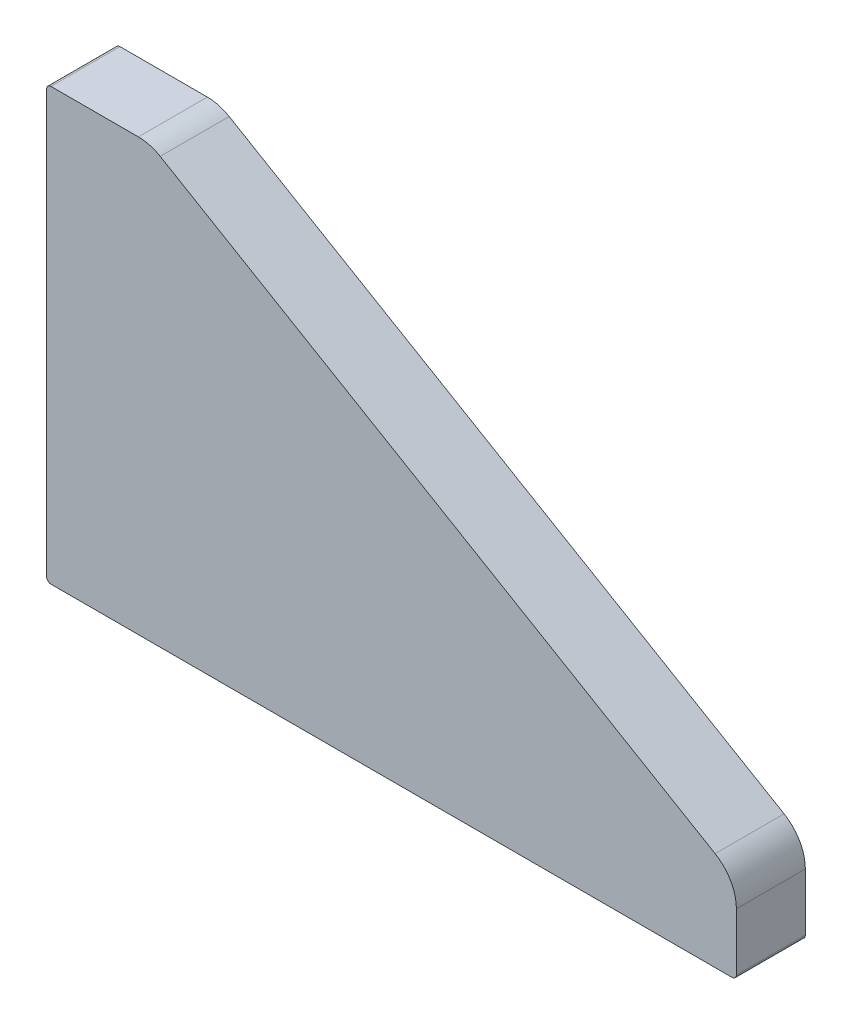
ISO-10303-21;
HEADER;
FILE_DESCRIPTION(('STEP AP214'),'2;1');
FILE_NAME('part.step','',(''),(''),'','','');
FILE_SCHEMA(('AUTOMOTIVE_DESIGN { 1 0 10303 214 1 1 1 1 }'));
ENDSEC;
DATA;
#1=APPLICATION_CONTEXT('core data for automotive mechanical design processes');
#2=APPLICATION_PROTOCOL_DEFINITION('international standard','automotive_design',2000,#1);
#3=PRODUCT_CONTEXT('',#1,'mechanical');
#4=PRODUCT('Part','Part','',(#3));
#5=PRODUCT_RELATED_PRODUCT_CATEGORY('part','',(#4));
#6=PRODUCT_DEFINITION_FORMATION('','',#4);
#7=PRODUCT_DEFINITION_CONTEXT('part definition',#1,'design');
#8=PRODUCT_DEFINITION('design','',#6,#7);
#9=PRODUCT_DEFINITION_SHAPE('','',#8);
#10=(LENGTH_UNIT() NAMED_UNIT(*) SI_UNIT(.MILLI.,.METRE.));
#11=(NAMED_UNIT(*) PLANE_ANGLE_UNIT() SI_UNIT($,.RADIAN.));
#12=(NAMED_UNIT(*) SI_UNIT($,.STERADIAN.) SOLID_ANGLE_UNIT());
#13=UNCERTAINTY_MEASURE_WITH_UNIT(LENGTH_MEASURE(1.E-05),#10,'distance_accuracy_value','');
#14=(GEOMETRIC_REPRESENTATION_CONTEXT(3) GLOBAL_UNCERTAINTY_ASSIGNED_CONTEXT((#13)) GLOBAL_UNIT_ASSIGNED_CONTEXT((#10,
#11,#12)) REPRESENTATION_CONTEXT('',''));
#15=CARTESIAN_POINT('',(0.,0.,0.));
#16=DIRECTION('',(0.,0.,1.));
#17=DIRECTION('',(1.,0.,0.));
#18=AXIS2_PLACEMENT_3D('',#15,#16,#17);
#19=CARTESIAN_POINT('',(0.,50.,8.));
#20=DIRECTION('',(1.,0.,0.));
#21=DIRECTION('',(0.,1.,0.));
#22=AXIS2_PLACEMENT_3D('',#19,#20,#21);
#23=PLANE('',#22);
#24=CARTESIAN_POINT('',(0.,6.,4.));
#25=DIRECTION('',(-1.,0.,0.));
#26=DIRECTION('',(0.,0.,1.));
#27=AXIS2_PLACEMENT_3D('',#24,#25,#26);
#28=CIRCLE('',#27,1.64999999999999);
#29=CARTESIAN_POINT('',(0.,6.,5.64999999999999));
#30=VERTEX_POINT('',#29);
#31=EDGE_CURVE('E172',#30,#30,#28,.T.);
#32=ORIENTED_EDGE('',*,*,#31,.F.);
#33=EDGE_LOOP('',(#32));
#34=FACE_BOUND('',#33,.T.);
#35=DIRECTION('',(0.,-1.,0.));
#36=VECTOR('',#35,1.);
#37=CARTESIAN_POINT('',(0.,50.,0.));
#38=LINE('',#37,#36);
#39=CARTESIAN_POINT('',(0.,49.5,0.));
#40=VERTEX_POINT('',#39);
#41=CARTESIAN_POINT('',(0.,0.5,0.));
#42=VERTEX_POINT('',#41);
#43=EDGE_CURVE('E180',#40,#42,#38,.T.);
#44=ORIENTED_EDGE('',*,*,#43,.T.);
#45=DIRECTION('',(0.,0.,-1.));
#46=VECTOR('',#45,1.);
#47=CARTESIAN_POINT('',(0.,0.5,8.));
#48=LINE('',#47,#46);
#49=CARTESIAN_POINT('',(0.,0.5,8.));
#50=VERTEX_POINT('',#49);
#51=EDGE_CURVE('E263',#42,#50,#48,.F.);
#52=ORIENTED_EDGE('',*,*,#51,.T.);
#53=DIRECTION('',(0.,-1.,0.));
#54=VECTOR('',#53,1.);
#55=CARTESIAN_POINT('',(0.,50.,8.));
#56=LINE('',#55,#54);
#57=CARTESIAN_POINT('',(0.,49.5,8.));
#58=VERTEX_POINT('',#57);
#59=EDGE_CURVE('E181',#58,#50,#56,.T.);
#60=ORIENTED_EDGE('',*,*,#59,.F.);
#61=DIRECTION('',(0.,0.,-1.));
#62=VECTOR('',#61,1.);
#63=CARTESIAN_POINT('',(0.,49.5,8.));
#64=LINE('',#63,#62);
#65=EDGE_CURVE('E259',#58,#40,#64,.T.);
#66=ORIENTED_EDGE('',*,*,#65,.T.);
#67=EDGE_LOOP('',(#44,#52,#60,#66));
#68=FACE_BOUND('',#67,.T.);
#69=CARTESIAN_POINT('',(0.,43.5,4.));
#70=DIRECTION('',(-1.,0.,0.));
#71=DIRECTION('',(0.,0.,1.));
#72=AXIS2_PLACEMENT_3D('',#69,#70,#71);
#73=CIRCLE('',#72,1.64999999999999);
#74=CARTESIAN_POINT('',(0.,43.5,5.64999999999999));
#75=VERTEX_POINT('',#74);
#76=EDGE_CURVE('E164',#75,#75,#73,.T.);
#77=ORIENTED_EDGE('',*,*,#76,.F.);
#78=EDGE_LOOP('',(#77));
#79=FACE_BOUND('',#78,.T.);
#80=ADVANCED_FACE('F47',(#34,#68,#79),#23,.F.);
#81=CARTESIAN_POINT('',(0.,0.,8.));
#82=DIRECTION('',(0.,1.,0.));
#83=DIRECTION('',(0.,0.,1.));
#84=AXIS2_PLACEMENT_3D('',#81,#82,#83);
#85=PLANE('',#84);
#86=CARTESIAN_POINT('',(20.,0.,4.));
#87=DIRECTION('',(0.,-1.,0.));
#88=DIRECTION('',(0.,0.,-1.));
#89=AXIS2_PLACEMENT_3D('',#86,#87,#88);
#90=CIRCLE('',#89,1.64999999999999);
#91=CARTESIAN_POINT('',(20.,0.,2.35000000000001));
#92=VERTEX_POINT('',#91);
#93=EDGE_CURVE('E149',#92,#92,#90,.T.);
#94=ORIENTED_EDGE('',*,*,#93,.F.);
#95=EDGE_LOOP('',(#94));
#96=FACE_BOUND('',#95,.T.);
#97=CARTESIAN_POINT('',(65.,0.,4.));
#98=DIRECTION('',(0.,-1.,0.));
#99=DIRECTION('',(0.,0.,-1.));
#100=AXIS2_PLACEMENT_3D('',#97,#98,#99);
#101=CIRCLE('',#100,1.64999999999998);
#102=CARTESIAN_POINT('',(65.,0.,2.35000000000002));
#103=VERTEX_POINT('',#102);
#104=EDGE_CURVE('E148',#103,#103,#101,.T.);
#105=ORIENTED_EDGE('',*,*,#104,.F.);
#106=EDGE_LOOP('',(#105));
#107=FACE_BOUND('',#106,.T.);
#108=DIRECTION('',(1.,0.,0.));
#109=VECTOR('',#108,1.);
#110=CARTESIAN_POINT('',(0.,0.,8.));
#111=LINE('',#110,#109);
#112=CARTESIAN_POINT('',(0.5,0.,8.));
#113=VERTEX_POINT('',#112);
#114=CARTESIAN_POINT('',(79.5,0.,8.));
#115=VERTEX_POINT('',#114);
#116=EDGE_CURVE('E185',#113,#115,#111,.T.);
#117=ORIENTED_EDGE('',*,*,#116,.F.);
#118=DIRECTION('',(0.,0.,-1.));
#119=VECTOR('',#118,1.);
#120=CARTESIAN_POINT('',(0.5,0.,8.));
#121=LINE('',#120,#119);
#122=CARTESIAN_POINT('',(0.5,0.,0.));
#123=VERTEX_POINT('',#122);
#124=EDGE_CURVE('E246',#113,#123,#121,.T.);
#125=ORIENTED_EDGE('',*,*,#124,.T.);
#126=DIRECTION('',(1.,0.,0.));
#127=VECTOR('',#126,1.);
#128=CARTESIAN_POINT('',(0.,0.,0.));
#129=LINE('',#128,#127);
#130=CARTESIAN_POINT('',(79.5,0.,0.));
#131=VERTEX_POINT('',#130);
#132=EDGE_CURVE('E203',#123,#131,#129,.T.);
#133=ORIENTED_EDGE('',*,*,#132,.T.);
#134=DIRECTION('',(0.,0.,-1.));
#135=VECTOR('',#134,1.);
#136=CARTESIAN_POINT('',(79.5,0.,8.));
#137=LINE('',#136,#135);
#138=EDGE_CURVE('E243',#131,#115,#137,.F.);
#139=ORIENTED_EDGE('',*,*,#138,.T.);
#140=EDGE_LOOP('',(#117,#125,#133,#139));
#141=FACE_BOUND('',#140,.T.);
#142=ADVANCED_FACE('F356',(#96,#107,#141),#85,.F.);
#143=CARTESIAN_POINT('',(80.,0.,8.));
#144=DIRECTION('',(-1.,0.,0.));
#145=DIRECTION('',(0.,0.,1.));
#146=AXIS2_PLACEMENT_3D('',#143,#144,#145);
#147=PLANE('',#146);
#148=DIRECTION('',(0.,1.,0.));
#149=VECTOR('',#148,1.);
#150=CARTESIAN_POINT('',(80.,0.,8.));
#151=LINE('',#150,#149);
#152=CARTESIAN_POINT('',(80.,0.5,8.));
#153=VERTEX_POINT('',#152);
#154=CARTESIAN_POINT('',(80.,7.14026972843647,8.));
#155=VERTEX_POINT('',#154);
#156=EDGE_CURVE('E189',#153,#155,#151,.T.);
#157=ORIENTED_EDGE('',*,*,#156,.F.);
#158=DIRECTION('',(0.,0.,-1.));
#159=VECTOR('',#158,1.);
#160=CARTESIAN_POINT('',(80.,0.5,8.));
#161=LINE('',#160,#159);
#162=CARTESIAN_POINT('',(80.,0.5,0.));
#163=VERTEX_POINT('',#162);
#164=EDGE_CURVE('E11',#153,#163,#161,.T.);
#165=ORIENTED_EDGE('',*,*,#164,.T.);
#166=DIRECTION('',(0.,1.,0.));
#167=VECTOR('',#166,1.);
#168=CARTESIAN_POINT('',(80.,0.,0.));
#169=LINE('',#168,#167);
#170=CARTESIAN_POINT('',(80.,7.14026972843647,0.));
#171=VERTEX_POINT('',#170);
#172=EDGE_CURVE('E207',#163,#171,#169,.T.);
#173=ORIENTED_EDGE('',*,*,#172,.T.);
#174=DIRECTION('',(0.,0.,-1.));
#175=VECTOR('',#174,1.);
#176=CARTESIAN_POINT('',(80.,7.14026972843647,8.));
#177=LINE('',#176,#175);
#178=EDGE_CURVE('E229',#171,#155,#177,.F.);
#179=ORIENTED_EDGE('',*,*,#178,.T.);
#180=EDGE_LOOP('',(#157,#165,#173,#179));
#181=FACE_BOUND('',#180,.T.);
#182=ADVANCED_FACE('F387',(#181),#147,.F.);
#183=CARTESIAN_POINT('',(80.,10.,8.));
#184=DIRECTION('',(-0.507020126563394,-0.861934215157769,0.));
#185=DIRECTION('',(0.86193421515777,-0.507020126563394,0.));
#186=AXIS2_PLACEMENT_3D('',#183,#184,#185);
#187=PLANE('',#186);
#188=DIRECTION('',(-0.86193421515777,0.507020126563394,0.));
#189=VECTOR('',#188,1.);
#190=CARTESIAN_POINT('',(80.,10.,8.));
#191=LINE('',#190,#189);
#192=CARTESIAN_POINT('',(77.535100632817,11.4499408042253,8.));
#193=VERTEX_POINT('',#192);
#194=CARTESIAN_POINT('',(13.1735591711589,49.3096710757889,8.));
#195=VERTEX_POINT('',#194);
#196=EDGE_CURVE('E192',#193,#195,#191,.T.);
#197=ORIENTED_EDGE('',*,*,#196,.F.);
#198=DIRECTION('',(0.,0.,-1.));
#199=VECTOR('',#198,1.);
#200=CARTESIAN_POINT('',(77.535100632817,11.4499408042253,8.));
#201=LINE('',#200,#199);
#202=CARTESIAN_POINT('',(77.535100632817,11.4499408042253,0.));
#203=VERTEX_POINT('',#202);
#204=EDGE_CURVE('E218',#193,#203,#201,.T.);
#205=ORIENTED_EDGE('',*,*,#204,.T.);
#206=DIRECTION('',(-0.86193421515777,0.507020126563394,0.));
#207=VECTOR('',#206,1.);
#208=CARTESIAN_POINT('',(80.,10.,0.));
#209=LINE('',#208,#207);
#210=CARTESIAN_POINT('',(13.1735591711589,49.3096710757889,0.));
#211=VERTEX_POINT('',#210);
#212=EDGE_CURVE('E210',#203,#211,#209,.T.);
#213=ORIENTED_EDGE('',*,*,#212,.T.);
#214=DIRECTION('',(0.,0.,-1.));
#215=VECTOR('',#214,1.);
#216=CARTESIAN_POINT('',(13.173559171159,49.3096710757889,8.));
#217=LINE('',#216,#215);
#218=EDGE_CURVE('E199',#211,#195,#217,.F.);
#219=ORIENTED_EDGE('',*,*,#218,.T.);
#220=EDGE_LOOP('',(#197,#205,#213,#219));
#221=FACE_BOUND('',#220,.T.);
#222=ADVANCED_FACE('F379',(#221),#187,.F.);
#223=CARTESIAN_POINT('',(12.,50.,8.));
#224=DIRECTION('',(0.,-1.,0.));
#225=DIRECTION('',(0.,0.,-1.));
#226=AXIS2_PLACEMENT_3D('',#223,#224,#225);
#227=PLANE('',#226);
#228=DIRECTION('',(-1.,0.,0.));
#229=VECTOR('',#228,1.);
#230=CARTESIAN_POINT('',(12.,50.,0.));
#231=LINE('',#230,#229);
#232=CARTESIAN_POINT('',(10.638458538342,50.,0.));
#233=VERTEX_POINT('',#232);
#234=CARTESIAN_POINT('',(0.499999999999999,50.,0.));
#235=VERTEX_POINT('',#234);
#236=EDGE_CURVE('E186',#233,#235,#231,.T.);
#237=ORIENTED_EDGE('',*,*,#236,.T.);
#238=DIRECTION('',(0.,0.,-1.));
#239=VECTOR('',#238,1.);
#240=CARTESIAN_POINT('',(0.499999999999999,50.,8.));
#241=LINE('',#240,#239);
#242=CARTESIAN_POINT('',(0.499999999999999,50.,8.));
#243=VERTEX_POINT('',#242);
#244=EDGE_CURVE('E56',#235,#243,#241,.F.);
#245=ORIENTED_EDGE('',*,*,#244,.T.);
#246=DIRECTION('',(-1.,0.,0.));
#247=VECTOR('',#246,1.);
#248=CARTESIAN_POINT('',(12.,50.,8.));
#249=LINE('',#248,#247);
#250=CARTESIAN_POINT('',(10.638458538342,50.,8.));
#251=VERTEX_POINT('',#250);
#252=EDGE_CURVE('E196',#251,#243,#249,.T.);
#253=ORIENTED_EDGE('',*,*,#252,.F.);
#254=DIRECTION('',(0.,0.,-1.));
#255=VECTOR('',#254,1.);
#256=CARTESIAN_POINT('',(10.638458538342,50.,8.));
#257=LINE('',#256,#255);
#258=EDGE_CURVE('E239',#251,#233,#257,.T.);
#259=ORIENTED_EDGE('',*,*,#258,.T.);
#260=EDGE_LOOP('',(#237,#245,#253,#259));
#261=FACE_BOUND('',#260,.T.);
#262=ADVANCED_FACE('F370',(#261),#227,.F.);
#263=CARTESIAN_POINT('',(0.,0.,8.));
#264=DIRECTION('',(0.,0.,1.));
#265=DIRECTION('',(1.,0.,0.));
#266=AXIS2_PLACEMENT_3D('',#263,#264,#265);
#267=PLANE('',#266);
#268=ORIENTED_EDGE('',*,*,#59,.T.);
#269=CARTESIAN_POINT('',(0.5,0.5,8.));
#270=DIRECTION('',(0.,0.,1.));
#271=DIRECTION('',(1.,0.,0.));
#272=AXIS2_PLACEMENT_3D('',#269,#270,#271);
#273=CIRCLE('',#272,0.5);
#274=EDGE_CURVE('E271',#50,#113,#273,.T.);
#275=ORIENTED_EDGE('',*,*,#274,.T.);
#276=ORIENTED_EDGE('',*,*,#116,.T.);
#277=CARTESIAN_POINT('',(79.5,0.5,8.));
#278=DIRECTION('',(0.,0.,1.));
#279=DIRECTION('',(1.,0.,0.));
#280=AXIS2_PLACEMENT_3D('',#277,#278,#279);
#281=CIRCLE('',#280,0.5);
#282=EDGE_CURVE('E70',#115,#153,#281,.T.);
#283=ORIENTED_EDGE('',*,*,#282,.T.);
#284=ORIENTED_EDGE('',*,*,#156,.T.);
#285=CARTESIAN_POINT('',(75.,7.14026972843647,8.));
#286=DIRECTION('',(0.,0.,1.));
#287=DIRECTION('',(1.,0.,0.));
#288=AXIS2_PLACEMENT_3D('',#285,#286,#287);
#289=CIRCLE('',#288,5.);
#290=EDGE_CURVE('E236',#155,#193,#289,.T.);
#291=ORIENTED_EDGE('',*,*,#290,.T.);
#292=ORIENTED_EDGE('',*,*,#196,.T.);
#293=CARTESIAN_POINT('',(10.638458538342,45.,8.));
#294=DIRECTION('',(0.,0.,1.));
#295=DIRECTION('',(1.,0.,0.));
#296=AXIS2_PLACEMENT_3D('',#293,#294,#295);
#297=CIRCLE('',#296,5.);
#298=EDGE_CURVE('E233',#195,#251,#297,.T.);
#299=ORIENTED_EDGE('',*,*,#298,.T.);
#300=ORIENTED_EDGE('',*,*,#252,.T.);
#301=CARTESIAN_POINT('',(0.499999999999999,49.5,8.));
#302=DIRECTION('',(0.,0.,1.));
#303=DIRECTION('',(1.,0.,0.));
#304=AXIS2_PLACEMENT_3D('',#301,#302,#303);
#305=CIRCLE('',#304,0.5);
#306=EDGE_CURVE('E268',#243,#58,#305,.T.);
#307=ORIENTED_EDGE('',*,*,#306,.T.);
#308=EDGE_LOOP('',(#268,#275,#276,#283,#284,#291,#292,#299,#300,#307));
#309=FACE_BOUND('',#308,.T.);
#310=ADVANCED_FACE('F350',(#309),#267,.T.);
#311=CARTESIAN_POINT('',(0.,0.,0.));
#312=DIRECTION('',(0.,0.,1.));
#313=DIRECTION('',(1.,0.,0.));
#314=AXIS2_PLACEMENT_3D('',#311,#312,#313);
#315=PLANE('',#314);
#316=ORIENTED_EDGE('',*,*,#132,.F.);
#317=CARTESIAN_POINT('',(0.5,0.5,0.));
#318=DIRECTION('',(0.,0.,1.));
#319=DIRECTION('',(1.,0.,0.));
#320=AXIS2_PLACEMENT_3D('',#317,#318,#319);
#321=CIRCLE('',#320,0.5);
#322=EDGE_CURVE('E256',#123,#42,#321,.F.);
#323=ORIENTED_EDGE('',*,*,#322,.T.);
#324=ORIENTED_EDGE('',*,*,#43,.F.);
#325=CARTESIAN_POINT('',(0.499999999999999,49.5,0.));
#326=DIRECTION('',(0.,0.,1.));
#327=DIRECTION('',(1.,0.,0.));
#328=AXIS2_PLACEMENT_3D('',#325,#326,#327);
#329=CIRCLE('',#328,0.5);
#330=EDGE_CURVE('E253',#40,#235,#329,.F.);
#331=ORIENTED_EDGE('',*,*,#330,.T.);
#332=ORIENTED_EDGE('',*,*,#236,.F.);
#333=CARTESIAN_POINT('',(10.638458538342,45.,0.));
#334=DIRECTION('',(0.,0.,1.));
#335=DIRECTION('',(1.,0.,0.));
#336=AXIS2_PLACEMENT_3D('',#333,#334,#335);
#337=CIRCLE('',#336,5.);
#338=EDGE_CURVE('E222',#233,#211,#337,.F.);
#339=ORIENTED_EDGE('',*,*,#338,.T.);
#340=ORIENTED_EDGE('',*,*,#212,.F.);
#341=CARTESIAN_POINT('',(75.,7.14026972843647,0.));
#342=DIRECTION('',(0.,0.,1.));
#343=DIRECTION('',(1.,0.,0.));
#344=AXIS2_PLACEMENT_3D('',#341,#342,#343);
#345=CIRCLE('',#344,5.);
#346=EDGE_CURVE('E225',#203,#171,#345,.F.);
#347=ORIENTED_EDGE('',*,*,#346,.T.);
#348=ORIENTED_EDGE('',*,*,#172,.F.);
#349=CARTESIAN_POINT('',(79.5,0.5,0.));
#350=DIRECTION('',(0.,0.,1.));
#351=DIRECTION('',(1.,0.,0.));
#352=AXIS2_PLACEMENT_3D('',#349,#350,#351);
#353=CIRCLE('',#352,0.5);
#354=EDGE_CURVE('E250',#163,#131,#353,.F.);
#355=ORIENTED_EDGE('',*,*,#354,.T.);
#356=EDGE_LOOP('',(#316,#323,#324,#331,#332,#339,#340,#347,#348,#355));
#357=FACE_BOUND('',#356,.T.);
#358=ADVANCED_FACE('F362',(#357),#315,.F.);
#359=CARTESIAN_POINT('',(75.,7.14026972843647,8.));
#360=DIRECTION('',(0.,0.,-1.));
#361=DIRECTION('',(-1.,0.,0.));
#362=AXIS2_PLACEMENT_3D('',#359,#360,#361);
#363=CYLINDRICAL_SURFACE('',#362,5.);
#364=ORIENTED_EDGE('',*,*,#290,.F.);
#365=ORIENTED_EDGE('',*,*,#178,.F.);
#366=ORIENTED_EDGE('',*,*,#346,.F.);
#367=ORIENTED_EDGE('',*,*,#204,.F.);
#368=EDGE_LOOP('',(#364,#365,#366,#367));
#369=FACE_BOUND('',#368,.T.);
#370=ADVANCED_FACE('F383',(#369),#363,.T.);
#371=CARTESIAN_POINT('',(10.638458538342,45.,8.));
#372=DIRECTION('',(0.,0.,-1.));
#373=DIRECTION('',(-1.,0.,0.));
#374=AXIS2_PLACEMENT_3D('',#371,#372,#373);
#375=CYLINDRICAL_SURFACE('',#374,5.);
#376=ORIENTED_EDGE('',*,*,#298,.F.);
#377=ORIENTED_EDGE('',*,*,#218,.F.);
#378=ORIENTED_EDGE('',*,*,#338,.F.);
#379=ORIENTED_EDGE('',*,*,#258,.F.);
#380=EDGE_LOOP('',(#376,#377,#378,#379));
#381=FACE_BOUND('',#380,.T.);
#382=ADVANCED_FACE('F374',(#381),#375,.T.);
#383=CARTESIAN_POINT('',(0.5,0.5,8.));
#384=DIRECTION('',(0.,0.,-1.));
#385=DIRECTION('',(-1.,0.,0.));
#386=AXIS2_PLACEMENT_3D('',#383,#384,#385);
#387=CYLINDRICAL_SURFACE('',#386,0.5);
#388=ORIENTED_EDGE('',*,*,#274,.F.);
#389=ORIENTED_EDGE('',*,*,#51,.F.);
#390=ORIENTED_EDGE('',*,*,#322,.F.);
#391=ORIENTED_EDGE('',*,*,#124,.F.);
#392=EDGE_LOOP('',(#388,#389,#390,#391));
#393=FACE_BOUND('',#392,.T.);
#394=ADVANCED_FACE('F359',(#393),#387,.T.);
#395=CARTESIAN_POINT('',(0.499999999999999,49.5,8.));
#396=DIRECTION('',(0.,0.,-1.));
#397=DIRECTION('',(-1.,0.,0.));
#398=AXIS2_PLACEMENT_3D('',#395,#396,#397);
#399=CYLINDRICAL_SURFACE('',#398,0.5);
#400=ORIENTED_EDGE('',*,*,#306,.F.);
#401=ORIENTED_EDGE('',*,*,#244,.F.);
#402=ORIENTED_EDGE('',*,*,#330,.F.);
#403=ORIENTED_EDGE('',*,*,#65,.F.);
#404=EDGE_LOOP('',(#400,#401,#402,#403));
#405=FACE_BOUND('',#404,.T.);
#406=ADVANCED_FACE('F368',(#405),#399,.T.);
#407=CARTESIAN_POINT('',(79.5,0.5,8.));
#408=DIRECTION('',(0.,0.,-1.));
#409=DIRECTION('',(-1.,0.,0.));
#410=AXIS2_PLACEMENT_3D('',#407,#408,#409);
#411=CYLINDRICAL_SURFACE('',#410,0.5);
#412=ORIENTED_EDGE('',*,*,#282,.F.);
#413=ORIENTED_EDGE('',*,*,#138,.F.);
#414=ORIENTED_EDGE('',*,*,#354,.F.);
#415=ORIENTED_EDGE('',*,*,#164,.F.);
#416=EDGE_LOOP('',(#412,#413,#414,#415));
#417=FACE_BOUND('',#416,.T.);
#418=ADVANCED_FACE('F49',(#417),#411,.T.);
#419=CARTESIAN_POINT('',(14.6,6.,4.));
#420=DIRECTION('',(-1.,0.,0.));
#421=DIRECTION('',(0.,0.,1.));
#422=AXIS2_PLACEMENT_3D('',#419,#420,#421);
#423=CONICAL_SURFACE('',#422,1.65,1.02974425867665);
#424=CARTESIAN_POINT('',(15.5914200213955,6.,4.));
#425=VERTEX_POINT('',#424);
#426=VERTEX_LOOP('',#425);
#427=FACE_BOUND('',#426,.T.);
#428=CARTESIAN_POINT('',(14.6,6.,4.));
#429=DIRECTION('',(-1.,0.,0.));
#430=DIRECTION('',(0.,0.,1.));
#431=AXIS2_PLACEMENT_3D('',#428,#429,#430);
#432=CIRCLE('',#431,1.65);
#433=CARTESIAN_POINT('',(14.6,6.,5.65));
#434=VERTEX_POINT('',#433);
#435=EDGE_CURVE('E176',#434,#434,#432,.T.);
#436=ORIENTED_EDGE('',*,*,#435,.T.);
#437=EDGE_LOOP('',(#436));
#438=FACE_BOUND('',#437,.T.);
#439=ADVANCED_FACE('F391',(#427,#438),#423,.F.);
#440=CARTESIAN_POINT('',(0.,6.,4.));
#441=DIRECTION('',(-1.,0.,0.));
#442=DIRECTION('',(0.,0.,1.));
#443=AXIS2_PLACEMENT_3D('',#440,#441,#442);
#444=CYLINDRICAL_SURFACE('',#443,1.64999999999999);
#445=ORIENTED_EDGE('',*,*,#435,.F.);
#446=EDGE_LOOP('',(#445));
#447=FACE_BOUND('',#446,.T.);
#448=ORIENTED_EDGE('',*,*,#31,.T.);
#449=EDGE_LOOP('',(#448));
#450=FACE_BOUND('',#449,.T.);
#451=ADVANCED_FACE('F396',(#447,#450),#444,.F.);
#452=CARTESIAN_POINT('',(14.6,43.5,4.));
#453=DIRECTION('',(-1.,0.,0.));
#454=DIRECTION('',(0.,0.,1.));
#455=AXIS2_PLACEMENT_3D('',#452,#453,#454);
#456=CONICAL_SURFACE('',#455,1.65,1.02974425867665);
#457=CARTESIAN_POINT('',(15.5914200213955,43.5,4.));
#458=VERTEX_POINT('',#457);
#459=VERTEX_LOOP('',#458);
#460=FACE_BOUND('',#459,.T.);
#461=CARTESIAN_POINT('',(14.6,43.5,4.));
#462=DIRECTION('',(-1.,0.,0.));
#463=DIRECTION('',(0.,0.,1.));
#464=AXIS2_PLACEMENT_3D('',#461,#462,#463);
#465=CIRCLE('',#464,1.65);
#466=CARTESIAN_POINT('',(14.6,43.5,5.65));
#467=VERTEX_POINT('',#466);
#468=EDGE_CURVE('E168',#467,#467,#465,.T.);
#469=ORIENTED_EDGE('',*,*,#468,.T.);
#470=EDGE_LOOP('',(#469));
#471=FACE_BOUND('',#470,.T.);
#472=ADVANCED_FACE('F444',(#460,#471),#456,.F.);
#473=CARTESIAN_POINT('',(0.,43.5,4.));
#474=DIRECTION('',(-1.,0.,0.));
#475=DIRECTION('',(0.,0.,1.));
#476=AXIS2_PLACEMENT_3D('',#473,#474,#475);
#477=CYLINDRICAL_SURFACE('',#476,1.65);
#478=ORIENTED_EDGE('',*,*,#468,.F.);
#479=EDGE_LOOP('',(#478));
#480=FACE_BOUND('',#479,.T.);
#481=ORIENTED_EDGE('',*,*,#76,.T.);
#482=EDGE_LOOP('',(#481));
#483=FACE_BOUND('',#482,.T.);
#484=ADVANCED_FACE('F455',(#480,#483),#477,.F.);
#485=CARTESIAN_POINT('',(65.,14.6,4.));
#486=DIRECTION('',(0.,-1.,0.));
#487=DIRECTION('',(0.,0.,-1.));
#488=AXIS2_PLACEMENT_3D('',#485,#486,#487);
#489=CONICAL_SURFACE('',#488,1.65,1.02974425867665);
#490=CARTESIAN_POINT('',(65.,15.5914200213955,4.));
#491=VERTEX_POINT('',#490);
#492=VERTEX_LOOP('',#491);
#493=FACE_BOUND('',#492,.T.);
#494=CARTESIAN_POINT('',(65.,14.6,4.));
#495=DIRECTION('',(0.,-1.,0.));
#496=DIRECTION('',(0.,0.,-1.));
#497=AXIS2_PLACEMENT_3D('',#494,#495,#496);
#498=CIRCLE('',#497,1.65);
#499=CARTESIAN_POINT('',(65.,14.6,2.35));
#500=VERTEX_POINT('',#499);
#501=EDGE_CURVE('E156',#500,#500,#498,.T.);
#502=ORIENTED_EDGE('',*,*,#501,.T.);
#503=EDGE_LOOP('',(#502));
#504=FACE_BOUND('',#503,.T.);
#505=ADVANCED_FACE('F465',(#493,#504),#489,.F.);
#506=CARTESIAN_POINT('',(65.,0.,4.));
#507=DIRECTION('',(0.,-1.,0.));
#508=DIRECTION('',(0.,0.,-1.));
#509=AXIS2_PLACEMENT_3D('',#506,#507,#508);
#510=CYLINDRICAL_SURFACE('',#509,1.64999999999999);
#511=ORIENTED_EDGE('',*,*,#501,.F.);
#512=EDGE_LOOP('',(#511));
#513=FACE_BOUND('',#512,.T.);
#514=ORIENTED_EDGE('',*,*,#104,.T.);
#515=EDGE_LOOP('',(#514));
#516=FACE_BOUND('',#515,.T.);
#517=ADVANCED_FACE('F141',(#513,#516),#510,.F.);
#518=CARTESIAN_POINT('',(20.,14.6,4.));
#519=DIRECTION('',(0.,-1.,0.));
#520=DIRECTION('',(0.,0.,-1.));
#521=AXIS2_PLACEMENT_3D('',#518,#519,#520);
#522=CONICAL_SURFACE('',#521,1.65,1.02974425867665);
#523=CARTESIAN_POINT('',(20.,15.5914200213955,4.));
#524=VERTEX_POINT('',#523);
#525=VERTEX_LOOP('',#524);
#526=FACE_BOUND('',#525,.T.);
#527=CARTESIAN_POINT('',(20.,14.6,4.));
#528=DIRECTION('',(0.,-1.,0.));
#529=DIRECTION('',(0.,0.,-1.));
#530=AXIS2_PLACEMENT_3D('',#527,#528,#529);
#531=CIRCLE('',#530,1.65);
#532=CARTESIAN_POINT('',(20.,14.6,2.35));
#533=VERTEX_POINT('',#532);
#534=EDGE_CURVE('E145',#533,#533,#531,.T.);
#535=ORIENTED_EDGE('',*,*,#534,.T.);
#536=EDGE_LOOP('',(#535));
#537=FACE_BOUND('',#536,.T.);
#538=ADVANCED_FACE('F137',(#526,#537),#522,.F.);
#539=CARTESIAN_POINT('',(20.,0.,4.));
#540=DIRECTION('',(0.,-1.,0.));
#541=DIRECTION('',(0.,0.,-1.));
#542=AXIS2_PLACEMENT_3D('',#539,#540,#541);
#543=CYLINDRICAL_SURFACE('',#542,1.64999999999999);
#544=ORIENTED_EDGE('',*,*,#534,.F.);
#545=EDGE_LOOP('',(#544));
#546=FACE_BOUND('',#545,.T.);
#547=ORIENTED_EDGE('',*,*,#93,.T.);
#548=EDGE_LOOP('',(#547));
#549=FACE_BOUND('',#548,.T.);
#550=ADVANCED_FACE('F140',(#546,#549),#543,.F.);
#551=CLOSED_SHELL('',(#80,#142,#182,#222,#262,#310,#358,#370,#382,#394,#406,#418,#439,#451,#472,
#484,#505,#517,#538,#550));
#552=MANIFOLD_SOLID_BREP('B2',#551);
#553=ADVANCED_BREP_SHAPE_REPRESENTATION('',(#18,#552),#14);
#554=SHAPE_DEFINITION_REPRESENTATION(#9,#553);
ENDSEC;
END-ISO-10303-21;
